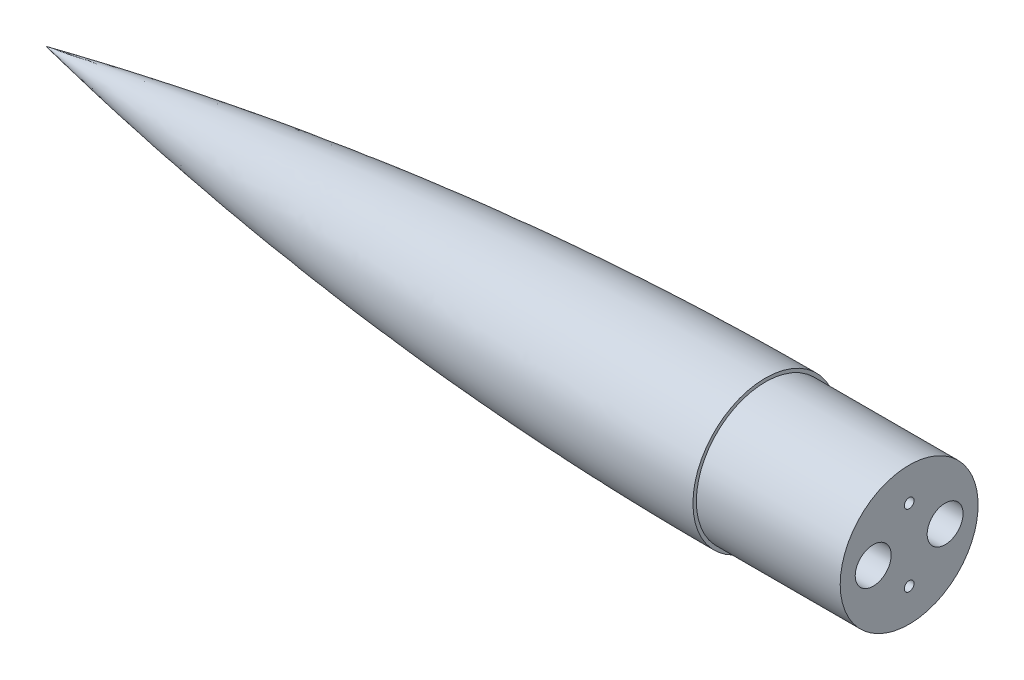
ISO-10303-21;
HEADER;
FILE_DESCRIPTION(('STEP AP214'),'2;1');
FILE_NAME('part.step','',(''),(''),'','','');
FILE_SCHEMA(('AUTOMOTIVE_DESIGN { 1 0 10303 214 1 1 1 1 }'));
ENDSEC;
DATA;
#1=APPLICATION_CONTEXT('core data for automotive mechanical design processes');
#2=APPLICATION_PROTOCOL_DEFINITION('international standard','automotive_design',2000,#1);
#3=PRODUCT_CONTEXT('',#1,'mechanical');
#4=PRODUCT('Part','Part','',(#3));
#5=PRODUCT_RELATED_PRODUCT_CATEGORY('part','',(#4));
#6=PRODUCT_DEFINITION_FORMATION('','',#4);
#7=PRODUCT_DEFINITION_CONTEXT('part definition',#1,'design');
#8=PRODUCT_DEFINITION('design','',#6,#7);
#9=PRODUCT_DEFINITION_SHAPE('','',#8);
#10=(LENGTH_UNIT() NAMED_UNIT(*) SI_UNIT(.MILLI.,.METRE.));
#11=(NAMED_UNIT(*) PLANE_ANGLE_UNIT() SI_UNIT($,.RADIAN.));
#12=(NAMED_UNIT(*) SI_UNIT($,.STERADIAN.) SOLID_ANGLE_UNIT());
#13=UNCERTAINTY_MEASURE_WITH_UNIT(LENGTH_MEASURE(1.E-05),#10,'distance_accuracy_value','');
#14=(GEOMETRIC_REPRESENTATION_CONTEXT(3) GLOBAL_UNCERTAINTY_ASSIGNED_CONTEXT((#13)) GLOBAL_UNIT_ASSIGNED_CONTEXT((#10,
#11,#12)) REPRESENTATION_CONTEXT('',''));
#15=CARTESIAN_POINT('',(0.,0.,0.));
#16=DIRECTION('',(0.,0.,1.));
#17=DIRECTION('',(1.,0.,0.));
#18=AXIS2_PLACEMENT_3D('',#15,#16,#17);
#19=CARTESIAN_POINT('',(508.000000000125,51.1048,0.));
#20=CARTESIAN_POINT('',(507.273632283384,51.1048,0.));
#21=CARTESIAN_POINT('',(505.808857652849,51.104007087415,0.));
#22=CARTESIAN_POINT('',(501.585135762507,51.0992496118976,0.));
#23=CARTESIAN_POINT('',(496.881841793305,51.0825984653294,0.));
#24=CARTESIAN_POINT('',(490.444224467608,51.0492962609402,0.));
#25=CARTESIAN_POINT('',(484.543653598536,50.9991860426861,0.));
#26=CARTESIAN_POINT('',(479.170809410203,50.9440214549803,0.));
#27=CARTESIAN_POINT('',(473.924175337011,50.8786942913101,0.));
#28=CARTESIAN_POINT('',(468.551333112905,50.802956320118,0.));
#29=CARTESIAN_POINT('',(462.343887520813,50.7001028633243,0.));
#30=CARTESIAN_POINT('',(455.212245733779,50.5626815567028,0.));
#31=CARTESIAN_POINT('',(448.100682592719,50.4053868225005,0.));
#32=CARTESIAN_POINT('',(439.199267742265,50.1839281530471,0.));
#33=CARTESIAN_POINT('',(430.305567660091,49.9293514485924,0.));
#34=CARTESIAN_POINT('',(421.40824923502,49.6416605474729,0.));
#35=CARTESIAN_POINT('',(412.514881745199,49.3208600630927,0.));
#36=CARTESIAN_POINT('',(405.399564609225,49.0443559245872,0.));
#37=CARTESIAN_POINT('',(398.285951754597,48.7479901924897,0.));
#38=CARTESIAN_POINT('',(391.172664945672,48.4317651761296,0.));
#39=CARTESIAN_POINT('',(382.282525687351,48.0116628827885,0.));
#40=CARTESIAN_POINT('',(371.616111910362,47.4678317291697,0.));
#41=CARTESIAN_POINT('',(359.175131847029,46.7754661039397,0.));
#42=CARTESIAN_POINT('',(344.961441701256,45.9048156120798,0.));
#43=CARTESIAN_POINT('',(330.752870377139,44.9548167789978,0.));
#44=CARTESIAN_POINT('',(312.999037596064,43.6681698136797,0.));
#45=CARTESIAN_POINT('',(281.060072425453,41.1143453593598,0.));
#46=CARTESIAN_POINT('',(234.983464043594,36.7387857932453,0.));
#47=CARTESIAN_POINT('',(189.013226456193,31.334973644178,0.));
#48=CARTESIAN_POINT('',(146.693369586303,25.479624228956,0.));
#49=CARTESIAN_POINT('',(120.294674251912,21.4759618677539,0.));
#50=CARTESIAN_POINT('',(109.74277409327,19.8253832459681,0.));
#51=CARTESIAN_POINT('',(100.954740669665,18.4171857879618,0.));
#52=CARTESIAN_POINT('',(93.9274464573221,17.2709968170559,0.));
#53=CARTESIAN_POINT('',(86.9034622371823,16.105210705512,0.));
#54=CARTESIAN_POINT('',(79.8826119178832,14.9197896249052,0.));
#55=CARTESIAN_POINT('',(72.8653497033021,13.7148240093174,0.));
#56=CARTESIAN_POINT('',(65.8510598866281,12.4901869886343,0.));
#57=CARTESIAN_POINT('',(58.8409118747888,11.2461146816929,0.));
#58=CARTESIAN_POINT('',(51.8331021171956,9.98223909690691,0.));
#59=CARTESIAN_POINT('',(44.830842505035,8.69921182346215,0.));
#60=CARTESIAN_POINT('',(38.7037945717687,7.55880279866596,0.));
#61=CARTESIAN_POINT('',(33.4595116307908,6.57015203599705,0.));
#62=CARTESIAN_POINT('',(29.1013876869219,5.74004597696923,0.));
#63=CARTESIAN_POINT('',(25.6534266090692,5.07852478680309,0.));
#64=CARTESIAN_POINT('',(22.1942330264822,4.40958931441436,0.));
#65=CARTESIAN_POINT('',(18.8114744303079,3.75114805076303,0.));
#66=CARTESIAN_POINT('',(15.3298513497355,3.06775726546572,0.));
#67=CARTESIAN_POINT('',(12.0237827806781,2.41519450451718,0.));
#68=CARTESIAN_POINT('',(8.40553470036082,1.69432436066893,0.));
#69=CARTESIAN_POINT('',(5.3909109981166,1.09129038935971,0.));
#70=CARTESIAN_POINT('',(2.15822542595158,0.437865373630878,0.));
#71=CARTESIAN_POINT('',(0.711812872641814,0.144680973513068,0.));
#72=CARTESIAN_POINT('',(-1.02361982456615E-09,-2.0805789482178E-10,0.));
#73=B_SPLINE_CURVE_WITH_KNOTS('',4,(#19,#20,#21,#22,#23,#24,#25,#26,#27,#28,#29,#30,#31,#32,#33,
#34,#35,#36,#37,#38,#39,#40,#41,#42,#43,#44,#45,#46,#47,#48,#49,#50,#51,#52,#53,#54,#55,#56,#57,
#58,#59,#60,#61,#62,#63,#64,#65,#66,#67,#68,#69,#70,#71,#72),.UNSPECIFIED.,.F.,.F.,(5,1,1,1,1,1,
1,1,1,1,1,1,1,1,1,1,1,1,1,1,1,1,1,1,1,1,1,1,1,1,1,1,1,1,1,1,1,1,1,1,1,1,1,1,1,1,1,1,1,1,5),
(0.0830303682116213,0.0887115459385796,0.0943927236655378,0.105755079119454,0.117117434573371,
0.128479790027287,0.1342861344961,0.140092478964913,0.151705167902538,0.163317856840163,
0.174930545777788,0.186543234573901,0.198155923370015,0.221381300962241,0.232993989904975,
0.24460667884771,0.256219367790444,0.267832056733178,0.279444745571042,0.291057434408907,
0.314282812084635,0.337508189852894,0.360733567621153,0.383958945353652,0.407184323086151,
0.453635079054215,0.569761968277129,0.685888855842048,0.709114233666462,0.732339611490877,
0.743952300566155,0.755564989641433,0.767177678716711,0.778790367791989,0.790403056887165,
0.802015745982341,0.813628435077518,0.825241124172694,0.83685381248157,0.848466500790446,
0.860079189099322,0.86588553325376,0.871691877408198,0.877373055625267,0.883054233842336,
0.888735412059405,0.894416590276474,0.900097768493544,0.905778946710613,0.911460124927682,
0.917141303144751),.UNSPECIFIED.);
#74=CARTESIAN_POINT('',(-6.88631389324929E-10,-1.39969077452527E-10,0.));
#75=DIRECTION('',(-1.,0.,0.));
#76=AXIS1_PLACEMENT('',#74,#75);
#77=SURFACE_OF_REVOLUTION('',#73,#76);
#78=CARTESIAN_POINT('',(-6.88631389324929E-10,-1.39969077452527E-10,0.));
#79=VERTEX_POINT('',#78);
#80=VERTEX_LOOP('',#79);
#81=FACE_BOUND('',#80,.T.);
#82=CARTESIAN_POINT('',(508.000000000077,-1.39969077452527E-10,0.));
#83=DIRECTION('',(-1.,0.,0.));
#84=DIRECTION('',(0.,0.,1.));
#85=AXIS2_PLACEMENT_3D('',#82,#83,#84);
#86=CIRCLE('',#85,51.10480000014);
#87=CARTESIAN_POINT('',(508.000000000077,-1.39969077452527E-10,51.10480000014));
#88=VERTEX_POINT('',#87);
#89=EDGE_CURVE('E54',#88,#88,#86,.T.);
#90=ORIENTED_EDGE('',*,*,#89,.T.);
#91=EDGE_LOOP('',(#90));
#92=FACE_BOUND('',#91,.T.);
#93=ADVANCED_FACE('F45',(#81,#92),#77,.T.);
#94=CARTESIAN_POINT('',(508.000000000077,-1.39969077452527E-10,0.));
#95=DIRECTION('',(-1.,0.,0.));
#96=DIRECTION('',(0.,0.,1.));
#97=AXIS2_PLACEMENT_3D('',#94,#95,#96);
#98=PLANE('',#97);
#99=CARTESIAN_POINT('',(508.000000000077,0.,0.));
#100=DIRECTION('',(-1.,0.,0.));
#101=DIRECTION('',(0.,0.,1.));
#102=AXIS2_PLACEMENT_3D('',#99,#100,#101);
#103=CIRCLE('',#102,48.7045);
#104=CARTESIAN_POINT('',(508.000000000077,0.,48.7045));
#105=VERTEX_POINT('',#104);
#106=EDGE_CURVE('E11',#105,#105,#103,.F.);
#107=ORIENTED_EDGE('',*,*,#106,.F.);
#108=EDGE_LOOP('',(#107));
#109=FACE_BOUND('',#108,.T.);
#110=ORIENTED_EDGE('',*,*,#89,.F.);
#111=EDGE_LOOP('',(#110));
#112=FACE_BOUND('',#111,.T.);
#113=ADVANCED_FACE('F60',(#109,#112),#98,.F.);
#114=CARTESIAN_POINT('',(584.200000000077,0.,0.));
#115=DIRECTION('',(-1.,0.,0.));
#116=DIRECTION('',(0.,0.,1.));
#117=AXIS2_PLACEMENT_3D('',#114,#115,#116);
#118=CYLINDRICAL_SURFACE('',#117,48.7045);
#119=CARTESIAN_POINT('',(609.600000000077,0.,0.));
#120=DIRECTION('',(1.,0.,0.));
#121=DIRECTION('',(0.,0.,-1.));
#122=AXIS2_PLACEMENT_3D('',#119,#120,#121);
#123=CIRCLE('',#122,48.7045);
#124=CARTESIAN_POINT('',(609.600000000077,0.,48.7045));
#125=VERTEX_POINT('',#124);
#126=EDGE_CURVE('E75',#125,#125,#123,.T.);
#127=CARTESIAN_POINT('',(508.000000000077,0.,48.7045));
#128=CARTESIAN_POINT('',(509.05833333341,0.,48.7045));
#129=CARTESIAN_POINT('',(510.116666666743,0.,48.7045));
#130=CARTESIAN_POINT('',(512.23333333341,0.,48.7045));
#131=CARTESIAN_POINT('',(513.291666666743,0.,48.7045));
#132=CARTESIAN_POINT('',(515.40833333341,0.,48.7045));
#133=CARTESIAN_POINT('',(516.466666666743,0.,48.7045));
#134=CARTESIAN_POINT('',(518.58333333341,0.,48.7045));
#135=CARTESIAN_POINT('',(519.641666666743,0.,48.7045));
#136=CARTESIAN_POINT('',(521.75833333341,0.,48.7045));
#137=CARTESIAN_POINT('',(522.816666666743,0.,48.7045));
#138=CARTESIAN_POINT('',(524.93333333341,0.,48.7045));
#139=CARTESIAN_POINT('',(525.991666666743,0.,48.7045));
#140=CARTESIAN_POINT('',(528.10833333341,0.,48.7045));
#141=CARTESIAN_POINT('',(529.166666666743,0.,48.7045));
#142=CARTESIAN_POINT('',(531.28333333341,0.,48.7045));
#143=CARTESIAN_POINT('',(532.341666666743,0.,48.7045));
#144=CARTESIAN_POINT('',(534.45833333341,0.,48.7045));
#145=CARTESIAN_POINT('',(535.516666666743,0.,48.7045));
#146=CARTESIAN_POINT('',(537.63333333341,0.,48.7045));
#147=CARTESIAN_POINT('',(538.691666666743,0.,48.7045));
#148=CARTESIAN_POINT('',(540.80833333341,0.,48.7045));
#149=CARTESIAN_POINT('',(541.866666666743,0.,48.7045));
#150=CARTESIAN_POINT('',(543.98333333341,0.,48.7045));
#151=CARTESIAN_POINT('',(545.041666666743,0.,48.7045));
#152=CARTESIAN_POINT('',(547.15833333341,0.,48.7045));
#153=CARTESIAN_POINT('',(548.216666666743,0.,48.7045));
#154=CARTESIAN_POINT('',(550.33333333341,0.,48.7045));
#155=CARTESIAN_POINT('',(551.391666666743,0.,48.7045));
#156=CARTESIAN_POINT('',(553.50833333341,0.,48.7045));
#157=CARTESIAN_POINT('',(554.566666666743,0.,48.7045));
#158=CARTESIAN_POINT('',(556.68333333341,0.,48.7045));
#159=CARTESIAN_POINT('',(557.741666666743,0.,48.7045));
#160=CARTESIAN_POINT('',(559.85833333341,0.,48.7045));
#161=CARTESIAN_POINT('',(560.916666666743,0.,48.7045));
#162=CARTESIAN_POINT('',(563.03333333341,0.,48.7045));
#163=CARTESIAN_POINT('',(564.091666666743,0.,48.7045));
#164=CARTESIAN_POINT('',(566.20833333341,0.,48.7045));
#165=CARTESIAN_POINT('',(567.266666666743,0.,48.7045));
#166=CARTESIAN_POINT('',(569.38333333341,0.,48.7045));
#167=CARTESIAN_POINT('',(570.441666666743,0.,48.7045));
#168=CARTESIAN_POINT('',(572.55833333341,0.,48.7045));
#169=CARTESIAN_POINT('',(573.616666666743,0.,48.7045));
#170=CARTESIAN_POINT('',(575.73333333341,0.,48.7045));
#171=CARTESIAN_POINT('',(576.791666666743,0.,48.7045));
#172=CARTESIAN_POINT('',(578.90833333341,0.,48.7045));
#173=CARTESIAN_POINT('',(579.966666666743,0.,48.7045));
#174=CARTESIAN_POINT('',(582.08333333341,0.,48.7045));
#175=CARTESIAN_POINT('',(583.141666666743,0.,48.7045));
#176=CARTESIAN_POINT('',(585.25833333341,0.,48.7045));
#177=CARTESIAN_POINT('',(586.316666666743,0.,48.7045));
#178=CARTESIAN_POINT('',(588.43333333341,0.,48.7045));
#179=CARTESIAN_POINT('',(589.491666666743,0.,48.7045));
#180=CARTESIAN_POINT('',(591.60833333341,0.,48.7045));
#181=CARTESIAN_POINT('',(592.666666666743,0.,48.7045));
#182=CARTESIAN_POINT('',(594.78333333341,0.,48.7045));
#183=CARTESIAN_POINT('',(595.841666666743,0.,48.7045));
#184=CARTESIAN_POINT('',(597.95833333341,0.,48.7045));
#185=CARTESIAN_POINT('',(599.016666666743,0.,48.7045));
#186=CARTESIAN_POINT('',(601.13333333341,0.,48.7045));
#187=CARTESIAN_POINT('',(602.191666666743,0.,48.7045));
#188=CARTESIAN_POINT('',(604.30833333341,0.,48.7045));
#189=CARTESIAN_POINT('',(605.366666666743,0.,48.7045));
#190=CARTESIAN_POINT('',(607.48333333341,0.,48.7045));
#191=CARTESIAN_POINT('',(608.541666666743,0.,48.7045));
#192=CARTESIAN_POINT('',(609.600000000077,0.,48.7045));
#193=B_SPLINE_CURVE_WITH_KNOTS('',3,(#127,#128,#129,#130,#131,#132,#133,#134,#135,#136,#137,
#138,#139,#140,#141,#142,#143,#144,#145,#146,#147,#148,#149,#150,#151,#152,#153,#154,#155,#156,
#157,#158,#159,#160,#161,#162,#163,#164,#165,#166,#167,#168,#169,#170,#171,#172,#173,#174,#175,
#176,#177,#178,#179,#180,#181,#182,#183,#184,#185,#186,#187,#188,#189,#190,#191,#192),
.UNSPECIFIED.,.F.,.F.,(4,2,2,2,2,2,2,2,2,2,2,2,2,2,2,2,2,2,2,2,2,2,2,2,2,2,2,2,2,2,2,2,4),(0.,
3.17500000000004,6.35000000000008,9.52500000000001,12.7,15.875,19.05,22.2250000000001,25.4,
28.575,31.7500000000001,34.925,38.1,41.2750000000001,44.45,47.625,50.8,53.975,57.15,60.325,63.5,
66.675,69.85,73.025,76.2,79.375,82.55,85.7249999999999,88.9,92.075,95.2499999999999,98.425,
101.6),.UNSPECIFIED.);
#194=EDGE_CURVE('BSEAM121',#105,#125,#193,.T.);
#195=ORIENTED_EDGE('',*,*,#106,.T.);
#196=ORIENTED_EDGE('',*,*,#126,.F.);
#197=ORIENTED_EDGE('',*,*,#194,.T.);
#198=ORIENTED_EDGE('',*,*,#194,.F.);
#199=EDGE_LOOP('',(#195,#197,#196,#198));
#200=FACE_BOUND('',#199,.T.);
#201=ADVANCED_FACE('F121',(#200),#118,.T.);
#202=CARTESIAN_POINT('',(609.600000000077,0.,0.));
#203=DIRECTION('',(1.,0.,0.));
#204=DIRECTION('',(0.,0.,-1.));
#205=AXIS2_PLACEMENT_3D('',#202,#203,#204);
#206=PLANE('',#205);
#207=CARTESIAN_POINT('',(609.600000000077,25.4,0.));
#208=DIRECTION('',(1.,0.,0.));
#209=DIRECTION('',(0.,0.,-1.));
#210=AXIS2_PLACEMENT_3D('',#207,#208,#209);
#211=CIRCLE('',#210,3.429);
#212=CARTESIAN_POINT('',(609.600000000077,25.4,-3.429));
#213=VERTEX_POINT('',#212);
#214=EDGE_CURVE('E100',#213,#213,#211,.T.);
#215=ORIENTED_EDGE('',*,*,#214,.F.);
#216=EDGE_LOOP('',(#215));
#217=FACE_BOUND('',#216,.T.);
#218=CARTESIAN_POINT('',(609.600000000077,-25.4,0.));
#219=DIRECTION('',(1.,0.,0.));
#220=DIRECTION('',(0.,0.,-1.));
#221=AXIS2_PLACEMENT_3D('',#218,#219,#220);
#222=CIRCLE('',#221,3.429);
#223=CARTESIAN_POINT('',(609.600000000077,-25.4,-3.42900000000001));
#224=VERTEX_POINT('',#223);
#225=EDGE_CURVE('E96',#224,#224,#222,.T.);
#226=ORIENTED_EDGE('',*,*,#225,.F.);
#227=EDGE_LOOP('',(#226));
#228=FACE_BOUND('',#227,.T.);
#229=CARTESIAN_POINT('',(609.600000000077,0.,25.4));
#230=DIRECTION('',(1.,0.,0.));
#231=DIRECTION('',(0.,0.,-1.));
#232=AXIS2_PLACEMENT_3D('',#229,#230,#231);
#233=CIRCLE('',#232,12.7);
#234=CARTESIAN_POINT('',(609.600000000077,0.,12.7));
#235=VERTEX_POINT('',#234);
#236=EDGE_CURVE('E80',#235,#235,#233,.T.);
#237=ORIENTED_EDGE('',*,*,#236,.F.);
#238=EDGE_LOOP('',(#237));
#239=FACE_BOUND('',#238,.T.);
#240=ORIENTED_EDGE('',*,*,#126,.T.);
#241=EDGE_LOOP('',(#240));
#242=FACE_BOUND('',#241,.T.);
#243=CARTESIAN_POINT('',(609.600000000077,0.,-25.4));
#244=DIRECTION('',(1.,0.,0.));
#245=DIRECTION('',(0.,0.,-1.));
#246=AXIS2_PLACEMENT_3D('',#243,#244,#245);
#247=CIRCLE('',#246,12.7);
#248=CARTESIAN_POINT('',(609.600000000077,0.,-38.1));
#249=VERTEX_POINT('',#248);
#250=EDGE_CURVE('E85',#249,#249,#247,.T.);
#251=ORIENTED_EDGE('',*,*,#250,.F.);
#252=EDGE_LOOP('',(#251));
#253=FACE_BOUND('',#252,.T.);
#254=ADVANCED_FACE('F117',(#217,#228,#239,#242,#253),#206,.T.);
#255=CARTESIAN_POINT('',(609.600000000077,0.,25.4));
#256=DIRECTION('',(-1.,0.,0.));
#257=DIRECTION('',(0.,0.,1.));
#258=AXIS2_PLACEMENT_3D('',#255,#256,#257);
#259=CYLINDRICAL_SURFACE('',#258,12.7);
#260=ORIENTED_EDGE('',*,*,#236,.T.);
#261=EDGE_LOOP('',(#260));
#262=FACE_BOUND('',#261,.T.);
#263=CARTESIAN_POINT('',(584.200000000077,0.,25.4));
#264=DIRECTION('',(1.,0.,0.));
#265=DIRECTION('',(0.,0.,-1.));
#266=AXIS2_PLACEMENT_3D('',#263,#264,#265);
#267=CIRCLE('',#266,12.7);
#268=CARTESIAN_POINT('',(584.200000000077,0.,38.1));
#269=VERTEX_POINT('',#268);
#270=EDGE_CURVE('E68',#269,#269,#267,.T.);
#271=ORIENTED_EDGE('',*,*,#270,.F.);
#272=EDGE_LOOP('',(#271));
#273=FACE_BOUND('',#272,.T.);
#274=ADVANCED_FACE('F120',(#262,#273),#259,.F.);
#275=CARTESIAN_POINT('',(609.600000000077,0.,-25.4));
#276=DIRECTION('',(-1.,0.,0.));
#277=DIRECTION('',(0.,0.,1.));
#278=AXIS2_PLACEMENT_3D('',#275,#276,#277);
#279=CYLINDRICAL_SURFACE('',#278,12.7);
#280=ORIENTED_EDGE('',*,*,#250,.T.);
#281=EDGE_LOOP('',(#280));
#282=FACE_BOUND('',#281,.T.);
#283=CARTESIAN_POINT('',(584.200000000077,0.,-25.4));
#284=DIRECTION('',(1.,0.,0.));
#285=DIRECTION('',(0.,0.,-1.));
#286=AXIS2_PLACEMENT_3D('',#283,#284,#285);
#287=CIRCLE('',#286,12.7);
#288=CARTESIAN_POINT('',(584.200000000077,0.,-38.1));
#289=VERTEX_POINT('',#288);
#290=EDGE_CURVE('E49',#289,#289,#287,.T.);
#291=ORIENTED_EDGE('',*,*,#290,.F.);
#292=EDGE_LOOP('',(#291));
#293=FACE_BOUND('',#292,.T.);
#294=ADVANCED_FACE('F129',(#282,#293),#279,.F.);
#295=CARTESIAN_POINT('',(584.200000000077,0.,0.));
#296=DIRECTION('',(0.,1.,0.));
#297=DIRECTION('',(0.,0.,1.));
#298=AXIS2_PLACEMENT_3D('',#295,#296,#297);
#299=TOROIDAL_SURFACE('',#298,25.4,12.7);
#300=CARTESIAN_POINT('',(584.200000000077,0.,0.));
#301=DIRECTION('',(0.,1.,0.));
#302=DIRECTION('',(0.,0.,1.));
#303=AXIS2_PLACEMENT_3D('',#300,#301,#302);
#304=CIRCLE('',#303,38.1);
#305=EDGE_CURVE('',#289,#269,#304,.T.);
#306=ORIENTED_EDGE('',*,*,#290,.T.);
#307=ORIENTED_EDGE('',*,*,#270,.T.);
#308=ORIENTED_EDGE('',*,*,#305,.T.);
#309=ORIENTED_EDGE('',*,*,#305,.F.);
#310=EDGE_LOOP('',(#306,#308,#307,#309));
#311=FACE_BOUND('',#310,.T.);
#312=ADVANCED_FACE('F132',(#311),#299,.F.);
#313=CARTESIAN_POINT('',(254.000000000077,-25.4,0.));
#314=DIRECTION('',(1.,0.,0.));
#315=DIRECTION('',(0.,0.,-1.));
#316=AXIS2_PLACEMENT_3D('',#313,#314,#315);
#317=CYLINDRICAL_SURFACE('',#316,3.429);
#318=CARTESIAN_POINT('',(254.000000000077,-25.4,0.));
#319=DIRECTION('',(1.,0.,0.));
#320=DIRECTION('',(0.,0.,-1.));
#321=AXIS2_PLACEMENT_3D('',#318,#319,#320);
#322=CIRCLE('',#321,3.429);
#323=CARTESIAN_POINT('',(254.000000000077,-25.4,-3.42900000000001));
#324=VERTEX_POINT('',#323);
#325=EDGE_CURVE('E92',#324,#324,#322,.T.);
#326=ORIENTED_EDGE('',*,*,#325,.F.);
#327=EDGE_LOOP('',(#326));
#328=FACE_BOUND('',#327,.T.);
#329=ORIENTED_EDGE('',*,*,#225,.T.);
#330=EDGE_LOOP('',(#329));
#331=FACE_BOUND('',#330,.T.);
#332=ADVANCED_FACE('F137',(#328,#331),#317,.F.);
#333=CARTESIAN_POINT('',(254.000000000077,-25.4,0.));
#334=DIRECTION('',(1.,0.,0.));
#335=DIRECTION('',(0.,0.,-1.));
#336=AXIS2_PLACEMENT_3D('',#333,#334,#335);
#337=PLANE('',#336);
#338=ORIENTED_EDGE('',*,*,#325,.T.);
#339=EDGE_LOOP('',(#338));
#340=FACE_BOUND('',#339,.T.);
#341=ADVANCED_FACE('F113',(#340),#337,.T.);
#342=CARTESIAN_POINT('',(254.000000000077,25.4,0.));
#343=DIRECTION('',(1.,0.,0.));
#344=DIRECTION('',(0.,0.,-1.));
#345=AXIS2_PLACEMENT_3D('',#342,#343,#344);
#346=CYLINDRICAL_SURFACE('',#345,3.429);
#347=CARTESIAN_POINT('',(254.000000000077,25.4,0.));
#348=DIRECTION('',(1.,0.,0.));
#349=DIRECTION('',(0.,0.,-1.));
#350=AXIS2_PLACEMENT_3D('',#347,#348,#349);
#351=CIRCLE('',#350,3.429);
#352=CARTESIAN_POINT('',(254.000000000077,25.4,-3.429));
#353=VERTEX_POINT('',#352);
#354=EDGE_CURVE('E91',#353,#353,#351,.T.);
#355=ORIENTED_EDGE('',*,*,#354,.F.);
#356=EDGE_LOOP('',(#355));
#357=FACE_BOUND('',#356,.T.);
#358=ORIENTED_EDGE('',*,*,#214,.T.);
#359=EDGE_LOOP('',(#358));
#360=FACE_BOUND('',#359,.T.);
#361=ADVANCED_FACE('F110',(#357,#360),#346,.F.);
#362=CARTESIAN_POINT('',(254.000000000077,25.4,0.));
#363=DIRECTION('',(1.,0.,0.));
#364=DIRECTION('',(0.,0.,-1.));
#365=AXIS2_PLACEMENT_3D('',#362,#363,#364);
#366=PLANE('',#365);
#367=ORIENTED_EDGE('',*,*,#354,.T.);
#368=EDGE_LOOP('',(#367));
#369=FACE_BOUND('',#368,.T.);
#370=ADVANCED_FACE('F108',(#369),#366,.T.);
#371=CLOSED_SHELL('',(#93,#113,#201,#254,#274,#294,#312,#332,#341,#361,#370));
#372=MANIFOLD_SOLID_BREP('B2',#371);
#373=ADVANCED_BREP_SHAPE_REPRESENTATION('',(#18,#372),#14);
#374=SHAPE_DEFINITION_REPRESENTATION(#9,#373);
ENDSEC;
END-ISO-10303-21;
